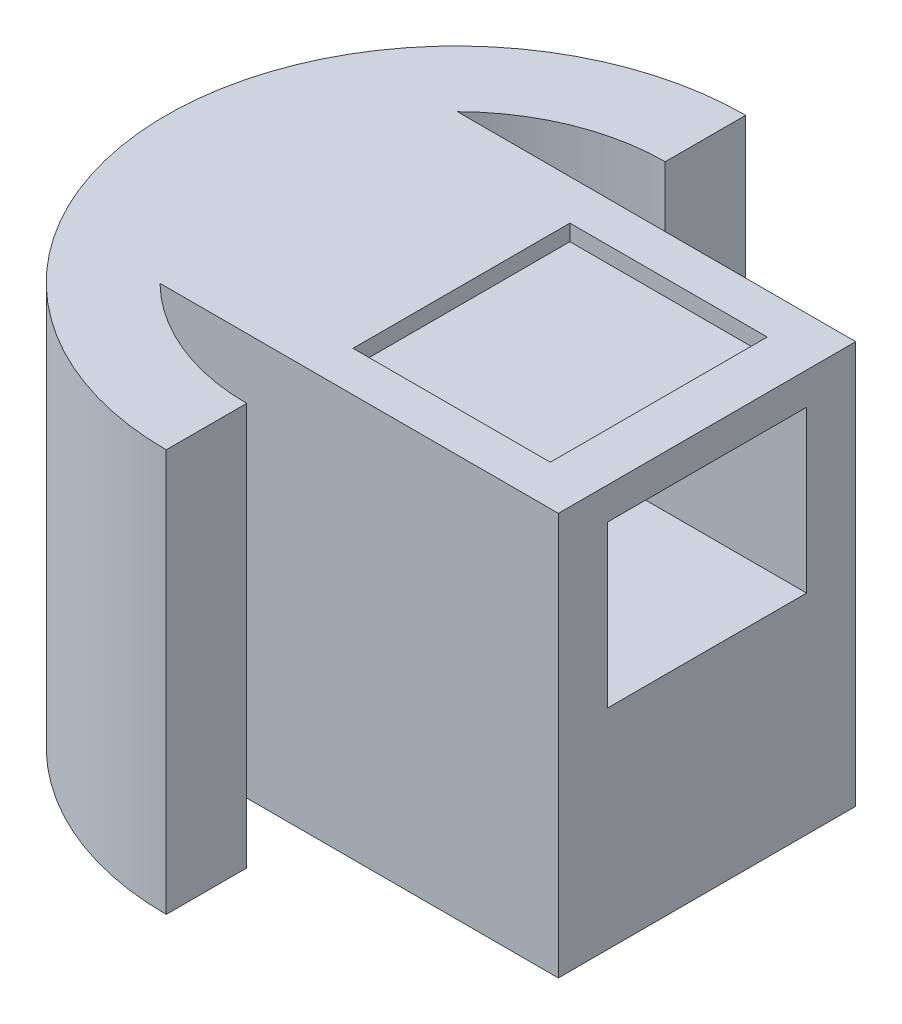
ISO-10303-21;
HEADER;
FILE_DESCRIPTION(('STEP AP214'),'2;1');
FILE_NAME('part.step','',(''),(''),'','','');
FILE_SCHEMA(('AUTOMOTIVE_DESIGN { 1 0 10303 214 1 1 1 1 }'));
ENDSEC;
DATA;
#1=APPLICATION_CONTEXT('core data for automotive mechanical design processes');
#2=APPLICATION_PROTOCOL_DEFINITION('international standard','automotive_design',2000,#1);
#3=PRODUCT_CONTEXT('',#1,'mechanical');
#4=PRODUCT('Part','Part','',(#3));
#5=PRODUCT_RELATED_PRODUCT_CATEGORY('part','',(#4));
#6=PRODUCT_DEFINITION_FORMATION('','',#4);
#7=PRODUCT_DEFINITION_CONTEXT('part definition',#1,'design');
#8=PRODUCT_DEFINITION('design','',#6,#7);
#9=PRODUCT_DEFINITION_SHAPE('','',#8);
#10=(LENGTH_UNIT() NAMED_UNIT(*) SI_UNIT(.MILLI.,.METRE.));
#11=(NAMED_UNIT(*) PLANE_ANGLE_UNIT() SI_UNIT($,.RADIAN.));
#12=(NAMED_UNIT(*) SI_UNIT($,.STERADIAN.) SOLID_ANGLE_UNIT());
#13=UNCERTAINTY_MEASURE_WITH_UNIT(LENGTH_MEASURE(1.E-05),#10,'distance_accuracy_value','');
#14=(GEOMETRIC_REPRESENTATION_CONTEXT(3) GLOBAL_UNCERTAINTY_ASSIGNED_CONTEXT((#13)) GLOBAL_UNIT_ASSIGNED_CONTEXT((#10,
#11,#12)) REPRESENTATION_CONTEXT('',''));
#15=CARTESIAN_POINT('',(0.,0.,0.));
#16=DIRECTION('',(0.,0.,1.));
#17=DIRECTION('',(1.,0.,0.));
#18=AXIS2_PLACEMENT_3D('',#15,#16,#17);
#19=CARTESIAN_POINT('',(0.,1270.,0.));
#20=DIRECTION('',(0.,-1.,0.));
#21=DIRECTION('',(0.,0.,-1.));
#22=AXIS2_PLACEMENT_3D('',#19,#20,#21);
#23=CYLINDRICAL_SURFACE('',#22,660.4);
#24=DIRECTION('',(0.,-1.,0.));
#25=VECTOR('',#24,1.);
#26=CARTESIAN_POINT('',(-464.690089615626,1270.,-469.245437498354));
#27=LINE('',#26,#25);
#28=CARTESIAN_POINT('',(-464.690089615626,0.,-469.245437498354));
#29=VERTEX_POINT('',#28);
#30=CARTESIAN_POINT('',(-464.690089615626,1270.,-469.245437498354));
#31=VERTEX_POINT('',#30);
#32=EDGE_CURVE('E191',#29,#31,#27,.F.);
#33=ORIENTED_EDGE('',*,*,#32,.F.);
#34=CARTESIAN_POINT('',(0.,0.,0.));
#35=DIRECTION('',(0.,1.,0.));
#36=DIRECTION('',(1.,0.,0.));
#37=AXIS2_PLACEMENT_3D('',#34,#35,#36);
#38=CIRCLE('',#37,660.4);
#39=CARTESIAN_POINT('',(0.,0.,-660.4));
#40=VERTEX_POINT('',#39);
#41=EDGE_CURVE('E259',#40,#29,#38,.T.);
#42=ORIENTED_EDGE('',*,*,#41,.F.);
#43=DIRECTION('',(0.,-1.,0.));
#44=VECTOR('',#43,1.);
#45=CARTESIAN_POINT('',(0.,1270.,-660.4));
#46=LINE('',#45,#44);
#47=CARTESIAN_POINT('',(0.,1270.,-660.4));
#48=VERTEX_POINT('',#47);
#49=EDGE_CURVE('E265',#48,#40,#46,.T.);
#50=ORIENTED_EDGE('',*,*,#49,.F.);
#51=CARTESIAN_POINT('',(0.,1270.,0.));
#52=DIRECTION('',(0.,1.,0.));
#53=DIRECTION('',(1.,0.,0.));
#54=AXIS2_PLACEMENT_3D('',#51,#52,#53);
#55=CIRCLE('',#54,660.4);
#56=EDGE_CURVE('E246',#48,#31,#55,.T.);
#57=ORIENTED_EDGE('',*,*,#56,.T.);
#58=EDGE_LOOP('',(#33,#42,#50,#57));
#59=FACE_BOUND('',#58,.T.);
#60=ADVANCED_FACE('F33',(#59),#23,.F.);
#61=DIRECTION('',(0.,-1.,0.));
#62=VECTOR('',#61,1.);
#63=CARTESIAN_POINT('',(-464.690089615635,1270.,469.245437498345));
#64=LINE('',#63,#62);
#65=CARTESIAN_POINT('',(-464.690089615635,1270.,469.245437498345));
#66=VERTEX_POINT('',#65);
#67=CARTESIAN_POINT('',(-464.690089615635,0.,469.245437498345));
#68=VERTEX_POINT('',#67);
#69=EDGE_CURVE('E202',#66,#68,#64,.T.);
#70=ORIENTED_EDGE('',*,*,#69,.F.);
#71=CARTESIAN_POINT('',(-1.21313511923537E-13,1270.,660.4));
#72=VERTEX_POINT('',#71);
#73=EDGE_CURVE('E245',#66,#72,#55,.T.);
#74=ORIENTED_EDGE('',*,*,#73,.T.);
#75=DIRECTION('',(0.,-1.,0.));
#76=VECTOR('',#75,1.);
#77=CARTESIAN_POINT('',(-1.21313511923537E-13,1270.,660.4));
#78=LINE('',#77,#76);
#79=CARTESIAN_POINT('',(-1.21313511923537E-13,0.,660.4));
#80=VERTEX_POINT('',#79);
#81=EDGE_CURVE('E41',#72,#80,#78,.T.);
#82=ORIENTED_EDGE('',*,*,#81,.T.);
#83=EDGE_CURVE('E258',#68,#80,#38,.T.);
#84=ORIENTED_EDGE('',*,*,#83,.F.);
#85=EDGE_LOOP('',(#70,#74,#82,#84));
#86=FACE_BOUND('',#85,.T.);
#87=ADVANCED_FACE('F272',(#86),#23,.F.);
#88=CARTESIAN_POINT('',(0.,1270.,0.));
#89=DIRECTION('',(0.,-1.,0.));
#90=DIRECTION('',(0.,0.,-1.));
#91=AXIS2_PLACEMENT_3D('',#88,#89,#90);
#92=CYLINDRICAL_SURFACE('',#91,914.4);
#93=CARTESIAN_POINT('',(0.,660.400001701587,0.));
#94=DIRECTION('',(0.,-1.,0.));
#95=DIRECTION('',(0.,0.,-1.));
#96=AXIS2_PLACEMENT_3D('',#93,#94,#95);
#97=CIRCLE('',#96,914.4);
#98=CARTESIAN_POINT('',(-858.71127437319,660.400001701586,314.232886987301));
#99=VERTEX_POINT('',#98);
#100=CARTESIAN_POINT('',(-858.711274373189,660.400001701587,-314.232886987301));
#101=VERTEX_POINT('',#100);
#102=EDGE_CURVE('E228',#99,#101,#97,.T.);
#103=ORIENTED_EDGE('',*,*,#102,.T.);
#104=DIRECTION('',(0.,-1.,0.));
#105=VECTOR('',#104,1.);
#106=CARTESIAN_POINT('',(-858.711274373189,1270.,-314.232886987301));
#107=LINE('',#106,#105);
#108=CARTESIAN_POINT('',(-858.711274373189,1168.40000170159,-314.232886987301));
#109=VERTEX_POINT('',#108);
#110=EDGE_CURVE('E231',#101,#109,#107,.F.);
#111=ORIENTED_EDGE('',*,*,#110,.T.);
#112=CARTESIAN_POINT('',(0.,1168.40000170159,0.));
#113=DIRECTION('',(0.,1.,0.));
#114=DIRECTION('',(0.,0.,1.));
#115=AXIS2_PLACEMENT_3D('',#112,#113,#114);
#116=CIRCLE('',#115,914.4);
#117=CARTESIAN_POINT('',(-858.711274373189,1168.40000170159,314.232886987301));
#118=VERTEX_POINT('',#117);
#119=EDGE_CURVE('E217',#109,#118,#116,.T.);
#120=ORIENTED_EDGE('',*,*,#119,.T.);
#121=DIRECTION('',(0.,-1.,0.));
#122=VECTOR('',#121,1.);
#123=CARTESIAN_POINT('',(-858.711274373189,1270.,314.232886987301));
#124=LINE('',#123,#122);
#125=EDGE_CURVE('E225',#118,#99,#124,.T.);
#126=ORIENTED_EDGE('',*,*,#125,.T.);
#127=EDGE_LOOP('',(#103,#111,#120,#126));
#128=FACE_BOUND('',#127,.T.);
#129=CARTESIAN_POINT('',(0.,0.,0.));
#130=DIRECTION('',(0.,1.,0.));
#131=DIRECTION('',(0.,0.,1.));
#132=AXIS2_PLACEMENT_3D('',#129,#130,#131);
#133=CIRCLE('',#132,914.4);
#134=CARTESIAN_POINT('',(1.11981703314034E-13,0.,-914.4));
#135=VERTEX_POINT('',#134);
#136=CARTESIAN_POINT('',(0.,0.,914.4));
#137=VERTEX_POINT('',#136);
#138=EDGE_CURVE('E237',#135,#137,#133,.T.);
#139=ORIENTED_EDGE('',*,*,#138,.T.);
#140=DIRECTION('',(0.,-1.,0.));
#141=VECTOR('',#140,1.);
#142=CARTESIAN_POINT('',(0.,1270.,914.4));
#143=LINE('',#142,#141);
#144=CARTESIAN_POINT('',(0.,1270.,914.4));
#145=VERTEX_POINT('',#144);
#146=EDGE_CURVE('E11',#145,#137,#143,.T.);
#147=ORIENTED_EDGE('',*,*,#146,.F.);
#148=CARTESIAN_POINT('',(0.,1270.,0.));
#149=DIRECTION('',(0.,1.,0.));
#150=DIRECTION('',(0.,0.,1.));
#151=AXIS2_PLACEMENT_3D('',#148,#149,#150);
#152=CIRCLE('',#151,914.4);
#153=CARTESIAN_POINT('',(1.11981703314034E-13,1270.,-914.4));
#154=VERTEX_POINT('',#153);
#155=EDGE_CURVE('E239',#154,#145,#152,.T.);
#156=ORIENTED_EDGE('',*,*,#155,.F.);
#157=DIRECTION('',(0.,-1.,0.));
#158=VECTOR('',#157,1.);
#159=CARTESIAN_POINT('',(1.11981703314034E-13,1270.,-914.4));
#160=LINE('',#159,#158);
#161=EDGE_CURVE('E252',#154,#135,#160,.T.);
#162=ORIENTED_EDGE('',*,*,#161,.T.);
#163=EDGE_LOOP('',(#139,#147,#156,#162));
#164=FACE_BOUND('',#163,.T.);
#165=ADVANCED_FACE('F35',(#128,#164),#92,.T.);
#166=CARTESIAN_POINT('',(-1.21313511923537E-13,1270.,660.4));
#167=DIRECTION('',(1.,0.,0.));
#168=DIRECTION('',(0.,0.,-1.));
#169=AXIS2_PLACEMENT_3D('',#166,#167,#168);
#170=PLANE('',#169);
#171=DIRECTION('',(0.,0.,1.));
#172=VECTOR('',#171,1.);
#173=CARTESIAN_POINT('',(-1.21313511923537E-13,0.,660.4));
#174=LINE('',#173,#172);
#175=EDGE_CURVE('E255',#80,#137,#174,.T.);
#176=ORIENTED_EDGE('',*,*,#175,.F.);
#177=ORIENTED_EDGE('',*,*,#81,.F.);
#178=DIRECTION('',(0.,0.,1.));
#179=VECTOR('',#178,1.);
#180=CARTESIAN_POINT('',(-1.21313511923537E-13,1270.,660.4));
#181=LINE('',#180,#179);
#182=EDGE_CURVE('E241',#72,#145,#181,.T.);
#183=ORIENTED_EDGE('',*,*,#182,.T.);
#184=ORIENTED_EDGE('',*,*,#146,.T.);
#185=EDGE_LOOP('',(#176,#177,#183,#184));
#186=FACE_BOUND('',#185,.T.);
#187=ADVANCED_FACE('F276',(#186),#170,.T.);
#188=CARTESIAN_POINT('',(1.11981703314034E-13,1270.,-914.4));
#189=DIRECTION('',(1.,0.,0.));
#190=DIRECTION('',(0.,0.,-1.));
#191=AXIS2_PLACEMENT_3D('',#188,#189,#190);
#192=PLANE('',#191);
#193=DIRECTION('',(0.,0.,1.));
#194=VECTOR('',#193,1.);
#195=CARTESIAN_POINT('',(1.11981703314034E-13,0.,-914.4));
#196=LINE('',#195,#194);
#197=EDGE_CURVE('E242',#135,#40,#196,.T.);
#198=ORIENTED_EDGE('',*,*,#197,.F.);
#199=ORIENTED_EDGE('',*,*,#161,.F.);
#200=DIRECTION('',(0.,0.,1.));
#201=VECTOR('',#200,1.);
#202=CARTESIAN_POINT('',(1.11981703314034E-13,1270.,-914.4));
#203=LINE('',#202,#201);
#204=EDGE_CURVE('E249',#154,#48,#203,.T.);
#205=ORIENTED_EDGE('',*,*,#204,.T.);
#206=ORIENTED_EDGE('',*,*,#49,.T.);
#207=EDGE_LOOP('',(#198,#199,#205,#206));
#208=FACE_BOUND('',#207,.T.);
#209=ADVANCED_FACE('F298',(#208),#192,.T.);
#210=CARTESIAN_POINT('',(0.,1270.,0.));
#211=DIRECTION('',(0.,1.,0.));
#212=DIRECTION('',(1.,0.,0.));
#213=AXIS2_PLACEMENT_3D('',#210,#211,#212);
#214=PLANE('',#213);
#215=DIRECTION('',(0.,0.,1.));
#216=VECTOR('',#215,1.);
#217=CARTESIAN_POINT('',(17.4107947228677,1270.,342.245437498345));
#218=LINE('',#217,#216);
#219=CARTESIAN_POINT('',(17.4107947228677,1270.,-342.245437498354));
#220=VERTEX_POINT('',#219);
#221=CARTESIAN_POINT('',(17.4107947228677,1270.,342.245437498345));
#222=VERTEX_POINT('',#221);
#223=EDGE_CURVE('E48',#220,#222,#218,.T.);
#224=ORIENTED_EDGE('',*,*,#223,.F.);
#225=DIRECTION('',(-1.,0.,0.));
#226=VECTOR('',#225,1.);
#227=CARTESIAN_POINT('',(17.4107947228677,1270.,-342.245437498354));
#228=LINE('',#227,#226);
#229=CARTESIAN_POINT('',(640.07039193936,1270.,-342.245437498354));
#230=VERTEX_POINT('',#229);
#231=EDGE_CURVE('E165',#230,#220,#228,.T.);
#232=ORIENTED_EDGE('',*,*,#231,.F.);
#233=DIRECTION('',(0.,0.,-1.));
#234=VECTOR('',#233,1.);
#235=CARTESIAN_POINT('',(640.07039193936,1270.,342.245437498345));
#236=LINE('',#235,#234);
#237=CARTESIAN_POINT('',(640.07039193936,1270.,342.245437498345));
#238=VERTEX_POINT('',#237);
#239=EDGE_CURVE('E168',#238,#230,#236,.T.);
#240=ORIENTED_EDGE('',*,*,#239,.F.);
#241=DIRECTION('',(1.,0.,0.));
#242=VECTOR('',#241,1.);
#243=CARTESIAN_POINT('',(17.4107947228677,1270.,342.245437498345));
#244=LINE('',#243,#242);
#245=EDGE_CURVE('E174',#222,#238,#244,.T.);
#246=ORIENTED_EDGE('',*,*,#245,.F.);
#247=EDGE_LOOP('',(#224,#232,#240,#246));
#248=FACE_BOUND('',#247,.T.);
#249=DIRECTION('',(-1.,0.,0.));
#250=VECTOR('',#249,1.);
#251=CARTESIAN_POINT('',(792.47039193936,1270.,-469.245437498354));
#252=LINE('',#251,#250);
#253=CARTESIAN_POINT('',(792.47039193936,1270.,-469.245437498354));
#254=VERTEX_POINT('',#253);
#255=EDGE_CURVE('E180',#254,#31,#252,.T.);
#256=ORIENTED_EDGE('',*,*,#255,.T.);
#257=ORIENTED_EDGE('',*,*,#56,.F.);
#258=ORIENTED_EDGE('',*,*,#204,.F.);
#259=ORIENTED_EDGE('',*,*,#155,.T.);
#260=ORIENTED_EDGE('',*,*,#182,.F.);
#261=ORIENTED_EDGE('',*,*,#73,.F.);
#262=DIRECTION('',(1.,0.,0.));
#263=VECTOR('',#262,1.);
#264=CARTESIAN_POINT('',(792.47039193936,1270.,469.245437498345));
#265=LINE('',#264,#263);
#266=CARTESIAN_POINT('',(792.47039193936,1270.,469.245437498345));
#267=VERTEX_POINT('',#266);
#268=EDGE_CURVE('E193',#66,#267,#265,.T.);
#269=ORIENTED_EDGE('',*,*,#268,.T.);
#270=DIRECTION('',(0.,0.,-1.));
#271=VECTOR('',#270,1.);
#272=CARTESIAN_POINT('',(792.47039193936,1270.00000170159,-339.632886987301));
#273=LINE('',#272,#271);
#274=EDGE_CURVE('E235',#267,#254,#273,.T.);
#275=ORIENTED_EDGE('',*,*,#274,.T.);
#276=EDGE_LOOP('',(#256,#257,#258,#259,#260,#261,#269,#275));
#277=FACE_BOUND('',#276,.T.);
#278=ADVANCED_FACE('F292',(#248,#277),#214,.T.);
#279=CARTESIAN_POINT('',(0.,0.,0.));
#280=DIRECTION('',(0.,1.,0.));
#281=DIRECTION('',(1.,0.,0.));
#282=AXIS2_PLACEMENT_3D('',#279,#280,#281);
#283=PLANE('',#282);
#284=ORIENTED_EDGE('',*,*,#41,.T.);
#285=DIRECTION('',(-1.,0.,0.));
#286=VECTOR('',#285,1.);
#287=CARTESIAN_POINT('',(792.47039193936,0.,-469.245437498354));
#288=LINE('',#287,#286);
#289=CARTESIAN_POINT('',(792.47039193936,0.,-469.245437498354));
#290=VERTEX_POINT('',#289);
#291=EDGE_CURVE('E184',#290,#29,#288,.T.);
#292=ORIENTED_EDGE('',*,*,#291,.F.);
#293=DIRECTION('',(0.,0.,-1.));
#294=VECTOR('',#293,1.);
#295=CARTESIAN_POINT('',(792.47039193936,0.,-339.632886987301));
#296=LINE('',#295,#294);
#297=CARTESIAN_POINT('',(792.47039193936,0.,469.245437498345));
#298=VERTEX_POINT('',#297);
#299=EDGE_CURVE('E234',#298,#290,#296,.T.);
#300=ORIENTED_EDGE('',*,*,#299,.F.);
#301=DIRECTION('',(1.,0.,0.));
#302=VECTOR('',#301,1.);
#303=CARTESIAN_POINT('',(792.47039193936,0.,469.245437498345));
#304=LINE('',#303,#302);
#305=EDGE_CURVE('E194',#68,#298,#304,.T.);
#306=ORIENTED_EDGE('',*,*,#305,.F.);
#307=ORIENTED_EDGE('',*,*,#83,.T.);
#308=ORIENTED_EDGE('',*,*,#175,.T.);
#309=ORIENTED_EDGE('',*,*,#138,.F.);
#310=ORIENTED_EDGE('',*,*,#197,.T.);
#311=EDGE_LOOP('',(#284,#292,#300,#306,#307,#308,#309,#310));
#312=FACE_BOUND('',#311,.T.);
#313=ADVANCED_FACE('F280',(#312),#283,.F.);
#314=CARTESIAN_POINT('',(792.47039193936,1270.00000170159,-339.632886987301));
#315=DIRECTION('',(-1.,0.,0.));
#316=DIRECTION('',(0.,0.,1.));
#317=AXIS2_PLACEMENT_3D('',#314,#315,#316);
#318=PLANE('',#317);
#319=DIRECTION('',(0.,0.,1.));
#320=VECTOR('',#319,1.);
#321=CARTESIAN_POINT('',(792.47039193936,1168.40000170159,314.232886987301));
#322=LINE('',#321,#320);
#323=CARTESIAN_POINT('',(792.47039193936,1168.40000170159,-314.232886987301));
#324=VERTEX_POINT('',#323);
#325=CARTESIAN_POINT('',(792.47039193936,1168.40000170159,314.232886987301));
#326=VERTEX_POINT('',#325);
#327=EDGE_CURVE('E206',#324,#326,#322,.T.);
#328=ORIENTED_EDGE('',*,*,#327,.F.);
#329=DIRECTION('',(0.,1.,0.));
#330=VECTOR('',#329,1.);
#331=CARTESIAN_POINT('',(792.47039193936,1168.40000170159,-314.232886987301));
#332=LINE('',#331,#330);
#333=CARTESIAN_POINT('',(792.47039193936,660.400001701586,-314.232886987301));
#334=VERTEX_POINT('',#333);
#335=EDGE_CURVE('E204',#334,#324,#332,.T.);
#336=ORIENTED_EDGE('',*,*,#335,.F.);
#337=DIRECTION('',(0.,0.,-1.));
#338=VECTOR('',#337,1.);
#339=CARTESIAN_POINT('',(792.47039193936,660.400001701586,314.232886987301));
#340=LINE('',#339,#338);
#341=CARTESIAN_POINT('',(792.47039193936,660.400001701586,314.232886987301));
#342=VERTEX_POINT('',#341);
#343=EDGE_CURVE('E211',#342,#334,#340,.T.);
#344=ORIENTED_EDGE('',*,*,#343,.F.);
#345=DIRECTION('',(0.,-1.,0.));
#346=VECTOR('',#345,1.);
#347=CARTESIAN_POINT('',(792.47039193936,1168.40000170159,314.232886987301));
#348=LINE('',#347,#346);
#349=EDGE_CURVE('E208',#326,#342,#348,.T.);
#350=ORIENTED_EDGE('',*,*,#349,.F.);
#351=EDGE_LOOP('',(#328,#336,#344,#350));
#352=FACE_BOUND('',#351,.T.);
#353=ORIENTED_EDGE('',*,*,#299,.T.);
#354=DIRECTION('',(0.,1.,0.));
#355=VECTOR('',#354,1.);
#356=CARTESIAN_POINT('',(792.47039193936,0.,-469.245437498354));
#357=LINE('',#356,#355);
#358=EDGE_CURVE('E186',#290,#254,#357,.T.);
#359=ORIENTED_EDGE('',*,*,#358,.T.);
#360=ORIENTED_EDGE('',*,*,#274,.F.);
#361=DIRECTION('',(0.,1.,0.));
#362=VECTOR('',#361,1.);
#363=CARTESIAN_POINT('',(792.47039193936,0.,469.245437498345));
#364=LINE('',#363,#362);
#365=EDGE_CURVE('E197',#298,#267,#364,.T.);
#366=ORIENTED_EDGE('',*,*,#365,.F.);
#367=EDGE_LOOP('',(#353,#359,#360,#366));
#368=FACE_BOUND('',#367,.T.);
#369=ADVANCED_FACE('F288',(#352,#368),#318,.F.);
#370=CARTESIAN_POINT('',(-4287.52960806064,1168.40000170159,-314.232886987301));
#371=DIRECTION('',(0.,0.,-1.));
#372=DIRECTION('',(-1.,0.,0.));
#373=AXIS2_PLACEMENT_3D('',#370,#371,#372);
#374=PLANE('',#373);
#375=DIRECTION('',(1.,0.,0.));
#376=VECTOR('',#375,1.);
#377=CARTESIAN_POINT('',(-4287.52960806064,660.400001701586,-314.232886987301));
#378=LINE('',#377,#376);
#379=EDGE_CURVE('E215',#101,#334,#378,.T.);
#380=ORIENTED_EDGE('',*,*,#379,.T.);
#381=ORIENTED_EDGE('',*,*,#335,.T.);
#382=DIRECTION('',(1.,0.,0.));
#383=VECTOR('',#382,1.);
#384=CARTESIAN_POINT('',(-4287.52960806064,1168.40000170159,-314.232886987301));
#385=LINE('',#384,#383);
#386=EDGE_CURVE('E214',#109,#324,#385,.T.);
#387=ORIENTED_EDGE('',*,*,#386,.F.);
#388=ORIENTED_EDGE('',*,*,#110,.F.);
#389=EDGE_LOOP('',(#380,#381,#387,#388));
#390=FACE_BOUND('',#389,.T.);
#391=ADVANCED_FACE('F342',(#390),#374,.F.);
#392=CARTESIAN_POINT('',(-4287.52960806064,660.400001701586,314.232886987301));
#393=DIRECTION('',(0.,-1.,0.));
#394=DIRECTION('',(0.,0.,-1.));
#395=AXIS2_PLACEMENT_3D('',#392,#393,#394);
#396=PLANE('',#395);
#397=DIRECTION('',(1.,0.,0.));
#398=VECTOR('',#397,1.);
#399=CARTESIAN_POINT('',(-4287.52960806064,660.400001701586,314.232886987301));
#400=LINE('',#399,#398);
#401=EDGE_CURVE('E218',#99,#342,#400,.T.);
#402=ORIENTED_EDGE('',*,*,#401,.T.);
#403=ORIENTED_EDGE('',*,*,#343,.T.);
#404=ORIENTED_EDGE('',*,*,#379,.F.);
#405=ORIENTED_EDGE('',*,*,#102,.F.);
#406=EDGE_LOOP('',(#402,#403,#404,#405));
#407=FACE_BOUND('',#406,.T.);
#408=ADVANCED_FACE('F332',(#407),#396,.F.);
#409=CARTESIAN_POINT('',(-4287.52960806064,1168.40000170159,314.232886987301));
#410=DIRECTION('',(0.,0.,1.));
#411=DIRECTION('',(1.,0.,0.));
#412=AXIS2_PLACEMENT_3D('',#409,#410,#411);
#413=PLANE('',#412);
#414=DIRECTION('',(1.,0.,0.));
#415=VECTOR('',#414,1.);
#416=CARTESIAN_POINT('',(-4287.52960806064,1168.40000170159,314.232886987301));
#417=LINE('',#416,#415);
#418=EDGE_CURVE('E56',#118,#326,#417,.T.);
#419=ORIENTED_EDGE('',*,*,#418,.T.);
#420=ORIENTED_EDGE('',*,*,#349,.T.);
#421=ORIENTED_EDGE('',*,*,#401,.F.);
#422=ORIENTED_EDGE('',*,*,#125,.F.);
#423=EDGE_LOOP('',(#419,#420,#421,#422));
#424=FACE_BOUND('',#423,.T.);
#425=ADVANCED_FACE('F334',(#424),#413,.F.);
#426=CARTESIAN_POINT('',(-4287.52960806064,1168.40000170159,314.232886987301));
#427=DIRECTION('',(0.,1.,0.));
#428=DIRECTION('',(0.,0.,1.));
#429=AXIS2_PLACEMENT_3D('',#426,#427,#428);
#430=PLANE('',#429);
#431=ORIENTED_EDGE('',*,*,#386,.T.);
#432=ORIENTED_EDGE('',*,*,#327,.T.);
#433=ORIENTED_EDGE('',*,*,#418,.F.);
#434=ORIENTED_EDGE('',*,*,#119,.F.);
#435=EDGE_LOOP('',(#431,#432,#433,#434));
#436=FACE_BOUND('',#435,.T.);
#437=ADVANCED_FACE('F312',(#436),#430,.F.);
#438=CARTESIAN_POINT('',(792.47039193936,0.,469.245437498345));
#439=DIRECTION('',(0.,0.,1.));
#440=DIRECTION('',(1.,0.,0.));
#441=AXIS2_PLACEMENT_3D('',#438,#439,#440);
#442=PLANE('',#441);
#443=ORIENTED_EDGE('',*,*,#268,.F.);
#444=ORIENTED_EDGE('',*,*,#69,.T.);
#445=ORIENTED_EDGE('',*,*,#305,.T.);
#446=ORIENTED_EDGE('',*,*,#365,.T.);
#447=EDGE_LOOP('',(#443,#444,#445,#446));
#448=FACE_BOUND('',#447,.T.);
#449=ADVANCED_FACE('F286',(#448),#442,.T.);
#450=CARTESIAN_POINT('',(792.47039193936,0.,-469.245437498354));
#451=DIRECTION('',(0.,0.,-1.));
#452=DIRECTION('',(-1.,0.,0.));
#453=AXIS2_PLACEMENT_3D('',#450,#451,#452);
#454=PLANE('',#453);
#455=ORIENTED_EDGE('',*,*,#291,.T.);
#456=ORIENTED_EDGE('',*,*,#32,.T.);
#457=ORIENTED_EDGE('',*,*,#255,.F.);
#458=ORIENTED_EDGE('',*,*,#358,.F.);
#459=EDGE_LOOP('',(#455,#456,#457,#458));
#460=FACE_BOUND('',#459,.T.);
#461=ADVANCED_FACE('F303',(#460),#454,.T.);
#462=CARTESIAN_POINT('',(17.4107947228677,1219.2,342.245437498345));
#463=DIRECTION('',(-1.,0.,0.));
#464=DIRECTION('',(0.,0.,1.));
#465=AXIS2_PLACEMENT_3D('',#462,#463,#464);
#466=PLANE('',#465);
#467=ORIENTED_EDGE('',*,*,#223,.T.);
#468=DIRECTION('',(0.,1.,0.));
#469=VECTOR('',#468,1.);
#470=CARTESIAN_POINT('',(17.4107947228677,1219.2,342.245437498345));
#471=LINE('',#470,#469);
#472=CARTESIAN_POINT('',(17.4107947228677,1219.2,342.245437498345));
#473=VERTEX_POINT('',#472);
#474=EDGE_CURVE('E143',#473,#222,#471,.T.);
#475=ORIENTED_EDGE('',*,*,#474,.F.);
#476=DIRECTION('',(0.,0.,1.));
#477=VECTOR('',#476,1.);
#478=CARTESIAN_POINT('',(17.4107947228677,1219.2,342.245437498345));
#479=LINE('',#478,#477);
#480=CARTESIAN_POINT('',(17.4107947228677,1219.2,-342.245437498354));
#481=VERTEX_POINT('',#480);
#482=EDGE_CURVE('E147',#481,#473,#479,.T.);
#483=ORIENTED_EDGE('',*,*,#482,.F.);
#484=DIRECTION('',(0.,1.,0.));
#485=VECTOR('',#484,1.);
#486=CARTESIAN_POINT('',(17.4107947228677,1219.2,-342.245437498354));
#487=LINE('',#486,#485);
#488=EDGE_CURVE('E178',#481,#220,#487,.T.);
#489=ORIENTED_EDGE('',*,*,#488,.T.);
#490=EDGE_LOOP('',(#467,#475,#483,#489));
#491=FACE_BOUND('',#490,.T.);
#492=ADVANCED_FACE('F145',(#491),#466,.F.);
#493=CARTESIAN_POINT('',(17.4107947228677,1219.2,-342.245437498354));
#494=DIRECTION('',(0.,0.,-1.));
#495=DIRECTION('',(-1.,0.,0.));
#496=AXIS2_PLACEMENT_3D('',#493,#494,#495);
#497=PLANE('',#496);
#498=ORIENTED_EDGE('',*,*,#231,.T.);
#499=ORIENTED_EDGE('',*,*,#488,.F.);
#500=DIRECTION('',(-1.,0.,0.));
#501=VECTOR('',#500,1.);
#502=CARTESIAN_POINT('',(17.4107947228677,1219.2,-342.245437498354));
#503=LINE('',#502,#501);
#504=CARTESIAN_POINT('',(640.07039193936,1219.2,-342.245437498354));
#505=VERTEX_POINT('',#504);
#506=EDGE_CURVE('E153',#505,#481,#503,.T.);
#507=ORIENTED_EDGE('',*,*,#506,.F.);
#508=DIRECTION('',(0.,1.,0.));
#509=VECTOR('',#508,1.);
#510=CARTESIAN_POINT('',(640.07039193936,1219.2,-342.245437498354));
#511=LINE('',#510,#509);
#512=EDGE_CURVE('E181',#505,#230,#511,.T.);
#513=ORIENTED_EDGE('',*,*,#512,.T.);
#514=EDGE_LOOP('',(#498,#499,#507,#513));
#515=FACE_BOUND('',#514,.T.);
#516=ADVANCED_FACE('F310',(#515),#497,.F.);
#517=CARTESIAN_POINT('',(640.07039193936,1219.2,342.245437498345));
#518=DIRECTION('',(1.,0.,0.));
#519=DIRECTION('',(0.,0.,-1.));
#520=AXIS2_PLACEMENT_3D('',#517,#518,#519);
#521=PLANE('',#520);
#522=ORIENTED_EDGE('',*,*,#239,.T.);
#523=ORIENTED_EDGE('',*,*,#512,.F.);
#524=DIRECTION('',(0.,0.,-1.));
#525=VECTOR('',#524,1.);
#526=CARTESIAN_POINT('',(640.07039193936,1219.2,342.245437498345));
#527=LINE('',#526,#525);
#528=CARTESIAN_POINT('',(640.07039193936,1219.2,342.245437498345));
#529=VERTEX_POINT('',#528);
#530=EDGE_CURVE('E161',#529,#505,#527,.T.);
#531=ORIENTED_EDGE('',*,*,#530,.F.);
#532=DIRECTION('',(0.,1.,0.));
#533=VECTOR('',#532,1.);
#534=CARTESIAN_POINT('',(640.07039193936,1219.2,342.245437498345));
#535=LINE('',#534,#533);
#536=EDGE_CURVE('E152',#529,#238,#535,.T.);
#537=ORIENTED_EDGE('',*,*,#536,.T.);
#538=EDGE_LOOP('',(#522,#523,#531,#537));
#539=FACE_BOUND('',#538,.T.);
#540=ADVANCED_FACE('F452',(#539),#521,.F.);
#541=CARTESIAN_POINT('',(17.4107947228677,1219.2,342.245437498345));
#542=DIRECTION('',(0.,0.,1.));
#543=DIRECTION('',(1.,0.,0.));
#544=AXIS2_PLACEMENT_3D('',#541,#542,#543);
#545=PLANE('',#544);
#546=ORIENTED_EDGE('',*,*,#245,.T.);
#547=ORIENTED_EDGE('',*,*,#536,.F.);
#548=DIRECTION('',(1.,0.,0.));
#549=VECTOR('',#548,1.);
#550=CARTESIAN_POINT('',(17.4107947228677,1219.2,342.245437498345));
#551=LINE('',#550,#549);
#552=EDGE_CURVE('E156',#473,#529,#551,.T.);
#553=ORIENTED_EDGE('',*,*,#552,.F.);
#554=ORIENTED_EDGE('',*,*,#474,.T.);
#555=EDGE_LOOP('',(#546,#547,#553,#554));
#556=FACE_BOUND('',#555,.T.);
#557=ADVANCED_FACE('F157',(#556),#545,.F.);
#558=CARTESIAN_POINT('',(0.,1219.2,0.));
#559=DIRECTION('',(0.,-1.,0.));
#560=DIRECTION('',(0.,0.,-1.));
#561=AXIS2_PLACEMENT_3D('',#558,#559,#560);
#562=PLANE('',#561);
#563=ORIENTED_EDGE('',*,*,#482,.T.);
#564=ORIENTED_EDGE('',*,*,#552,.T.);
#565=ORIENTED_EDGE('',*,*,#530,.T.);
#566=ORIENTED_EDGE('',*,*,#506,.T.);
#567=EDGE_LOOP('',(#563,#564,#565,#566));
#568=FACE_BOUND('',#567,.T.);
#569=ADVANCED_FACE('F163',(#568),#562,.F.);
#570=CLOSED_SHELL('',(#60,#87,#165,#187,#209,#278,#313,#369,#391,#408,#425,#437,#449,#461,#492,
#516,#540,#557,#569));
#571=MANIFOLD_SOLID_BREP('B2',#570);
#572=ADVANCED_BREP_SHAPE_REPRESENTATION('',(#18,#571),#14);
#573=SHAPE_DEFINITION_REPRESENTATION(#9,#572);
ENDSEC;
END-ISO-10303-21;
